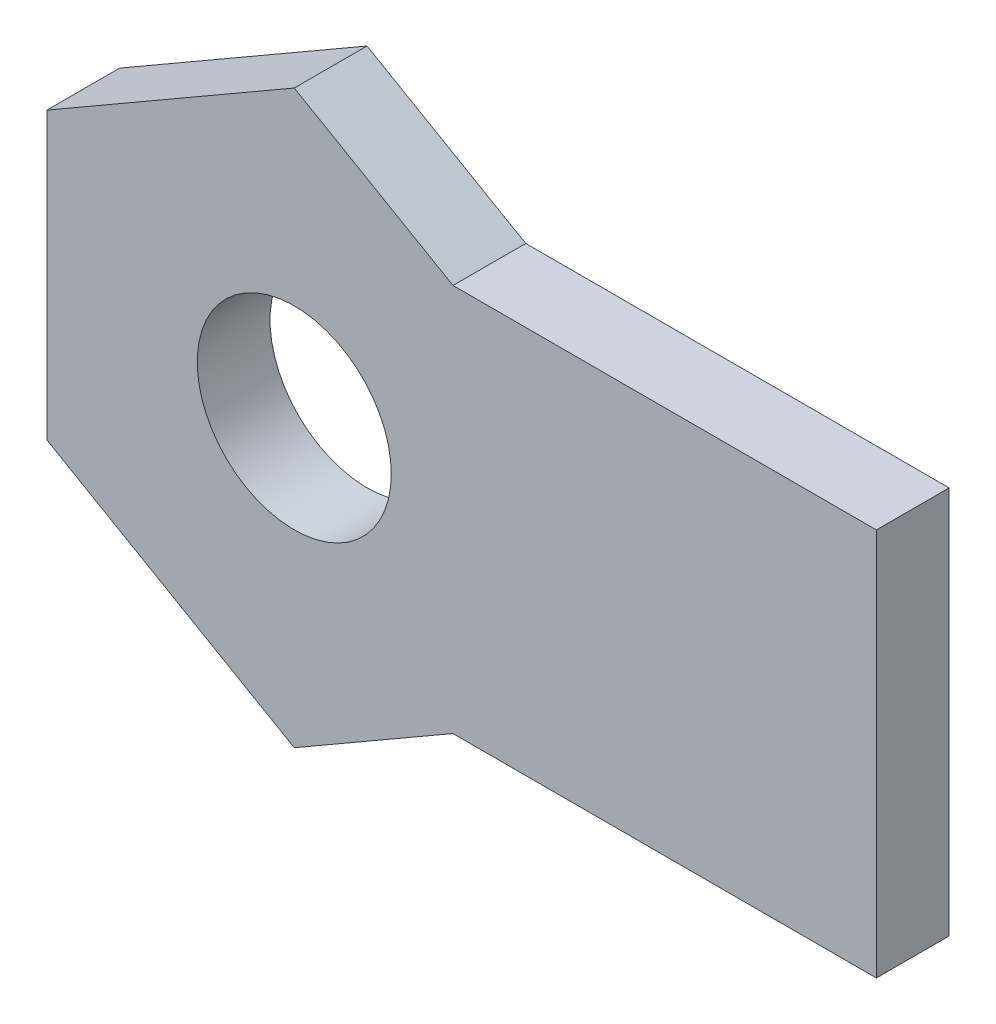
ISO-10303-21;
HEADER;
FILE_DESCRIPTION(('STEP AP214'),'2;1');
FILE_NAME('part.step','',(''),(''),'','','');
FILE_SCHEMA(('AUTOMOTIVE_DESIGN { 1 0 10303 214 1 1 1 1 }'));
ENDSEC;
DATA;
#1=APPLICATION_CONTEXT('core data for automotive mechanical design processes');
#2=APPLICATION_PROTOCOL_DEFINITION('international standard','automotive_design',2000,#1);
#3=PRODUCT_CONTEXT('',#1,'mechanical');
#4=PRODUCT('Part','Part','',(#3));
#5=PRODUCT_RELATED_PRODUCT_CATEGORY('part','',(#4));
#6=PRODUCT_DEFINITION_FORMATION('','',#4);
#7=PRODUCT_DEFINITION_CONTEXT('part definition',#1,'design');
#8=PRODUCT_DEFINITION('design','',#6,#7);
#9=PRODUCT_DEFINITION_SHAPE('','',#8);
#10=(LENGTH_UNIT() NAMED_UNIT(*) SI_UNIT(.MILLI.,.METRE.));
#11=(NAMED_UNIT(*) PLANE_ANGLE_UNIT() SI_UNIT($,.RADIAN.));
#12=(NAMED_UNIT(*) SI_UNIT($,.STERADIAN.) SOLID_ANGLE_UNIT());
#13=UNCERTAINTY_MEASURE_WITH_UNIT(LENGTH_MEASURE(1.E-05),#10,'distance_accuracy_value','');
#14=(GEOMETRIC_REPRESENTATION_CONTEXT(3) GLOBAL_UNCERTAINTY_ASSIGNED_CONTEXT((#13)) GLOBAL_UNIT_ASSIGNED_CONTEXT((#10,
#11,#12)) REPRESENTATION_CONTEXT('',''));
#15=CARTESIAN_POINT('',(0.,0.,0.));
#16=DIRECTION('',(0.,0.,1.));
#17=DIRECTION('',(1.,0.,0.));
#18=AXIS2_PLACEMENT_3D('',#15,#16,#17);
#19=CARTESIAN_POINT('',(-51.,0.,15.));
#20=DIRECTION('',(1.,0.,0.));
#21=DIRECTION('',(0.,1.,0.));
#22=AXIS2_PLACEMENT_3D('',#19,#20,#21);
#23=PLANE('',#22);
#24=DIRECTION('',(0.,-1.,0.));
#25=VECTOR('',#24,1.);
#26=CARTESIAN_POINT('',(-51.,0.,0.));
#27=LINE('',#26,#25);
#28=CARTESIAN_POINT('',(-51.,29.4448637286709,0.));
#29=VERTEX_POINT('',#28);
#30=CARTESIAN_POINT('',(-51.,-29.4448637286709,0.));
#31=VERTEX_POINT('',#30);
#32=EDGE_CURVE('E140',#29,#31,#27,.T.);
#33=ORIENTED_EDGE('',*,*,#32,.T.);
#34=DIRECTION('',(0.,0.,-1.));
#35=VECTOR('',#34,1.);
#36=CARTESIAN_POINT('',(-51.,-29.4448637286709,15.));
#37=LINE('',#36,#35);
#38=CARTESIAN_POINT('',(-51.,-29.4448637286709,15.));
#39=VERTEX_POINT('',#38);
#40=EDGE_CURVE('E11',#39,#31,#37,.T.);
#41=ORIENTED_EDGE('',*,*,#40,.F.);
#42=DIRECTION('',(0.,-1.,0.));
#43=VECTOR('',#42,1.);
#44=CARTESIAN_POINT('',(-51.,0.,15.));
#45=LINE('',#44,#43);
#46=CARTESIAN_POINT('',(-51.,29.4448637286709,15.));
#47=VERTEX_POINT('',#46);
#48=EDGE_CURVE('E183',#47,#39,#45,.T.);
#49=ORIENTED_EDGE('',*,*,#48,.F.);
#50=DIRECTION('',(0.,0.,-1.));
#51=VECTOR('',#50,1.);
#52=CARTESIAN_POINT('',(-51.,29.4448637286709,15.));
#53=LINE('',#52,#51);
#54=EDGE_CURVE('E136',#47,#29,#53,.T.);
#55=ORIENTED_EDGE('',*,*,#54,.T.);
#56=EDGE_LOOP('',(#33,#41,#49,#55));
#57=FACE_BOUND('',#56,.T.);
#58=ADVANCED_FACE('F39',(#57),#23,.F.);
#59=CARTESIAN_POINT('',(-25.5,-44.1672955930064,15.));
#60=DIRECTION('',(0.5,0.866025403784438,0.));
#61=DIRECTION('',(-0.866025403784439,0.5,0.));
#62=AXIS2_PLACEMENT_3D('',#59,#60,#61);
#63=PLANE('',#62);
#64=DIRECTION('',(0.866025403784439,-0.5,0.));
#65=VECTOR('',#64,1.);
#66=CARTESIAN_POINT('',(-25.5,-44.1672955930064,0.));
#67=LINE('',#66,#65);
#68=CARTESIAN_POINT('',(0.,-58.8897274573418,0.));
#69=VERTEX_POINT('',#68);
#70=EDGE_CURVE('E143',#31,#69,#67,.T.);
#71=ORIENTED_EDGE('',*,*,#70,.T.);
#72=DIRECTION('',(0.,0.,-1.));
#73=VECTOR('',#72,1.);
#74=CARTESIAN_POINT('',(0.,-58.8897274573418,15.));
#75=LINE('',#74,#73);
#76=CARTESIAN_POINT('',(0.,-58.8897274573418,15.));
#77=VERTEX_POINT('',#76);
#78=EDGE_CURVE('E48',#77,#69,#75,.T.);
#79=ORIENTED_EDGE('',*,*,#78,.F.);
#80=DIRECTION('',(0.866025403784439,-0.5,0.));
#81=VECTOR('',#80,1.);
#82=CARTESIAN_POINT('',(-25.5,-44.1672955930064,15.));
#83=LINE('',#82,#81);
#84=EDGE_CURVE('E98',#39,#77,#83,.T.);
#85=ORIENTED_EDGE('',*,*,#84,.F.);
#86=ORIENTED_EDGE('',*,*,#40,.T.);
#87=EDGE_LOOP('',(#71,#79,#85,#86));
#88=FACE_BOUND('',#87,.T.);
#89=ADVANCED_FACE('F201',(#88),#63,.F.);
#90=CARTESIAN_POINT('',(25.5,-44.1672955930064,15.));
#91=DIRECTION('',(-0.5,0.866025403784438,0.));
#92=DIRECTION('',(-0.866025403784438,-0.5,0.));
#93=AXIS2_PLACEMENT_3D('',#90,#91,#92);
#94=PLANE('',#93);
#95=DIRECTION('',(0.866025403784438,0.5,0.));
#96=VECTOR('',#95,1.);
#97=CARTESIAN_POINT('',(25.5,-44.1672955930064,0.));
#98=LINE('',#97,#96);
#99=CARTESIAN_POINT('',(32.7179676972449,-40.,0.));
#100=VERTEX_POINT('',#99);
#101=EDGE_CURVE('E145',#69,#100,#98,.T.);
#102=ORIENTED_EDGE('',*,*,#101,.T.);
#103=DIRECTION('',(0.,0.,-1.));
#104=VECTOR('',#103,1.);
#105=CARTESIAN_POINT('',(32.7179676972449,-40.,15.));
#106=LINE('',#105,#104);
#107=CARTESIAN_POINT('',(32.7179676972449,-40.,15.));
#108=VERTEX_POINT('',#107);
#109=EDGE_CURVE('E162',#108,#100,#106,.T.);
#110=ORIENTED_EDGE('',*,*,#109,.F.);
#111=DIRECTION('',(0.866025403784438,0.5,0.));
#112=VECTOR('',#111,1.);
#113=CARTESIAN_POINT('',(25.5,-44.1672955930064,15.));
#114=LINE('',#113,#112);
#115=EDGE_CURVE('E170',#77,#108,#114,.T.);
#116=ORIENTED_EDGE('',*,*,#115,.F.);
#117=ORIENTED_EDGE('',*,*,#78,.T.);
#118=EDGE_LOOP('',(#102,#110,#116,#117));
#119=FACE_BOUND('',#118,.T.);
#120=ADVANCED_FACE('F168',(#119),#94,.F.);
#121=CARTESIAN_POINT('',(0.,-40.,15.));
#122=DIRECTION('',(0.,1.,0.));
#123=DIRECTION('',(0.,0.,1.));
#124=AXIS2_PLACEMENT_3D('',#121,#122,#123);
#125=PLANE('',#124);
#126=DIRECTION('',(1.,0.,0.));
#127=VECTOR('',#126,1.);
#128=CARTESIAN_POINT('',(0.,-40.,0.));
#129=LINE('',#128,#127);
#130=CARTESIAN_POINT('',(120.,-40.,0.));
#131=VERTEX_POINT('',#130);
#132=EDGE_CURVE('E147',#100,#131,#129,.T.);
#133=ORIENTED_EDGE('',*,*,#132,.T.);
#134=DIRECTION('',(0.,0.,-1.));
#135=VECTOR('',#134,1.);
#136=CARTESIAN_POINT('',(120.,-40.,15.));
#137=LINE('',#136,#135);
#138=CARTESIAN_POINT('',(120.,-40.,15.));
#139=VERTEX_POINT('',#138);
#140=EDGE_CURVE('E160',#139,#131,#137,.T.);
#141=ORIENTED_EDGE('',*,*,#140,.F.);
#142=DIRECTION('',(1.,0.,0.));
#143=VECTOR('',#142,1.);
#144=CARTESIAN_POINT('',(0.,-40.,15.));
#145=LINE('',#144,#143);
#146=EDGE_CURVE('E131',#108,#139,#145,.T.);
#147=ORIENTED_EDGE('',*,*,#146,.F.);
#148=ORIENTED_EDGE('',*,*,#109,.T.);
#149=EDGE_LOOP('',(#133,#141,#147,#148));
#150=FACE_BOUND('',#149,.T.);
#151=ADVANCED_FACE('F178',(#150),#125,.F.);
#152=CARTESIAN_POINT('',(120.,0.,15.));
#153=DIRECTION('',(1.,0.,0.));
#154=DIRECTION('',(0.,1.,0.));
#155=AXIS2_PLACEMENT_3D('',#152,#153,#154);
#156=PLANE('',#155);
#157=DIRECTION('',(0.,-1.,0.));
#158=VECTOR('',#157,1.);
#159=CARTESIAN_POINT('',(120.,0.,0.));
#160=LINE('',#159,#158);
#161=CARTESIAN_POINT('',(120.,40.,0.));
#162=VERTEX_POINT('',#161);
#163=EDGE_CURVE('E150',#162,#131,#160,.T.);
#164=ORIENTED_EDGE('',*,*,#163,.F.);
#165=DIRECTION('',(0.,0.,-1.));
#166=VECTOR('',#165,1.);
#167=CARTESIAN_POINT('',(120.,40.,15.));
#168=LINE('',#167,#166);
#169=CARTESIAN_POINT('',(120.,40.,15.));
#170=VERTEX_POINT('',#169);
#171=EDGE_CURVE('E120',#170,#162,#168,.T.);
#172=ORIENTED_EDGE('',*,*,#171,.F.);
#173=DIRECTION('',(0.,-1.,0.));
#174=VECTOR('',#173,1.);
#175=CARTESIAN_POINT('',(120.,0.,15.));
#176=LINE('',#175,#174);
#177=EDGE_CURVE('E129',#170,#139,#176,.T.);
#178=ORIENTED_EDGE('',*,*,#177,.T.);
#179=ORIENTED_EDGE('',*,*,#140,.T.);
#180=EDGE_LOOP('',(#164,#172,#178,#179));
#181=FACE_BOUND('',#180,.T.);
#182=ADVANCED_FACE('F212',(#181),#156,.T.);
#183=CARTESIAN_POINT('',(0.,40.,15.));
#184=DIRECTION('',(0.,1.,0.));
#185=DIRECTION('',(-1.,0.,0.));
#186=AXIS2_PLACEMENT_3D('',#183,#184,#185);
#187=PLANE('',#186);
#188=DIRECTION('',(1.,0.,0.));
#189=VECTOR('',#188,1.);
#190=CARTESIAN_POINT('',(0.,40.,0.));
#191=LINE('',#190,#189);
#192=CARTESIAN_POINT('',(32.7179676972449,40.,0.));
#193=VERTEX_POINT('',#192);
#194=EDGE_CURVE('E119',#193,#162,#191,.T.);
#195=ORIENTED_EDGE('',*,*,#194,.F.);
#196=DIRECTION('',(0.,0.,-1.));
#197=VECTOR('',#196,1.);
#198=CARTESIAN_POINT('',(32.7179676972449,40.,15.));
#199=LINE('',#198,#197);
#200=CARTESIAN_POINT('',(32.7179676972449,40.,15.));
#201=VERTEX_POINT('',#200);
#202=EDGE_CURVE('E113',#201,#193,#199,.T.);
#203=ORIENTED_EDGE('',*,*,#202,.F.);
#204=DIRECTION('',(1.,0.,0.));
#205=VECTOR('',#204,1.);
#206=CARTESIAN_POINT('',(0.,40.,15.));
#207=LINE('',#206,#205);
#208=EDGE_CURVE('E117',#201,#170,#207,.T.);
#209=ORIENTED_EDGE('',*,*,#208,.T.);
#210=ORIENTED_EDGE('',*,*,#171,.T.);
#211=EDGE_LOOP('',(#195,#203,#209,#210));
#212=FACE_BOUND('',#211,.T.);
#213=ADVANCED_FACE('F115',(#212),#187,.T.);
#214=CARTESIAN_POINT('',(25.5,44.1672955930064,15.));
#215=DIRECTION('',(-0.5,-0.866025403784438,0.));
#216=DIRECTION('',(0.866025403784438,-0.5,0.));
#217=AXIS2_PLACEMENT_3D('',#214,#215,#216);
#218=PLANE('',#217);
#219=DIRECTION('',(-0.866025403784438,0.5,0.));
#220=VECTOR('',#219,1.);
#221=CARTESIAN_POINT('',(25.5,44.1672955930064,0.));
#222=LINE('',#221,#220);
#223=CARTESIAN_POINT('',(0.,58.8897274573419,0.));
#224=VERTEX_POINT('',#223);
#225=EDGE_CURVE('E84',#193,#224,#222,.T.);
#226=ORIENTED_EDGE('',*,*,#225,.T.);
#227=DIRECTION('',(0.,0.,-1.));
#228=VECTOR('',#227,1.);
#229=CARTESIAN_POINT('',(0.,58.8897274573419,15.));
#230=LINE('',#229,#228);
#231=CARTESIAN_POINT('',(0.,58.8897274573419,15.));
#232=VERTEX_POINT('',#231);
#233=EDGE_CURVE('E121',#232,#224,#230,.T.);
#234=ORIENTED_EDGE('',*,*,#233,.F.);
#235=DIRECTION('',(-0.866025403784438,0.5,0.));
#236=VECTOR('',#235,1.);
#237=CARTESIAN_POINT('',(25.5,44.1672955930064,15.));
#238=LINE('',#237,#236);
#239=EDGE_CURVE('E123',#201,#232,#238,.T.);
#240=ORIENTED_EDGE('',*,*,#239,.F.);
#241=ORIENTED_EDGE('',*,*,#202,.T.);
#242=EDGE_LOOP('',(#226,#234,#240,#241));
#243=FACE_BOUND('',#242,.T.);
#244=ADVANCED_FACE('F124',(#243),#218,.F.);
#245=CARTESIAN_POINT('',(0.,0.,15.));
#246=DIRECTION('',(0.,0.,-1.));
#247=DIRECTION('',(-1.,0.,0.));
#248=AXIS2_PLACEMENT_3D('',#245,#246,#247);
#249=CYLINDRICAL_SURFACE('',#248,20.);
#250=CARTESIAN_POINT('',(0.,0.,15.));
#251=DIRECTION('',(0.,0.,1.));
#252=DIRECTION('',(1.,0.,0.));
#253=AXIS2_PLACEMENT_3D('',#250,#251,#252);
#254=CIRCLE('',#253,20.);
#255=CARTESIAN_POINT('',(20.,0.,15.));
#256=VERTEX_POINT('',#255);
#257=EDGE_CURVE('E156',#256,#256,#254,.T.);
#258=ORIENTED_EDGE('',*,*,#257,.T.);
#259=EDGE_LOOP('',(#258));
#260=FACE_BOUND('',#259,.T.);
#261=CARTESIAN_POINT('',(0.,0.,0.));
#262=DIRECTION('',(0.,0.,1.));
#263=DIRECTION('',(1.,0.,0.));
#264=AXIS2_PLACEMENT_3D('',#261,#262,#263);
#265=CIRCLE('',#264,20.);
#266=CARTESIAN_POINT('',(20.,0.,0.));
#267=VERTEX_POINT('',#266);
#268=EDGE_CURVE('E137',#267,#267,#265,.T.);
#269=ORIENTED_EDGE('',*,*,#268,.F.);
#270=EDGE_LOOP('',(#269));
#271=FACE_BOUND('',#270,.T.);
#272=ADVANCED_FACE('F41',(#260,#271),#249,.F.);
#273=CARTESIAN_POINT('',(-25.5,44.1672955930064,15.));
#274=DIRECTION('',(0.5,-0.866025403784439,0.));
#275=DIRECTION('',(0.866025403784439,0.5,0.));
#276=AXIS2_PLACEMENT_3D('',#273,#274,#275);
#277=PLANE('',#276);
#278=DIRECTION('',(-0.866025403784439,-0.5,0.));
#279=VECTOR('',#278,1.);
#280=CARTESIAN_POINT('',(-25.5,44.1672955930064,0.));
#281=LINE('',#280,#279);
#282=EDGE_CURVE('E90',#224,#29,#281,.T.);
#283=ORIENTED_EDGE('',*,*,#282,.T.);
#284=ORIENTED_EDGE('',*,*,#54,.F.);
#285=DIRECTION('',(-0.866025403784439,-0.5,0.));
#286=VECTOR('',#285,1.);
#287=CARTESIAN_POINT('',(-25.5,44.1672955930064,15.));
#288=LINE('',#287,#286);
#289=EDGE_CURVE('E56',#232,#47,#288,.T.);
#290=ORIENTED_EDGE('',*,*,#289,.F.);
#291=ORIENTED_EDGE('',*,*,#233,.T.);
#292=EDGE_LOOP('',(#283,#284,#290,#291));
#293=FACE_BOUND('',#292,.T.);
#294=ADVANCED_FACE('F191',(#293),#277,.F.);
#295=CARTESIAN_POINT('',(0.,0.,15.));
#296=DIRECTION('',(0.,0.,1.));
#297=DIRECTION('',(1.,0.,0.));
#298=AXIS2_PLACEMENT_3D('',#295,#296,#297);
#299=PLANE('',#298);
#300=ORIENTED_EDGE('',*,*,#257,.F.);
#301=EDGE_LOOP('',(#300));
#302=FACE_BOUND('',#301,.T.);
#303=ORIENTED_EDGE('',*,*,#48,.T.);
#304=ORIENTED_EDGE('',*,*,#84,.T.);
#305=ORIENTED_EDGE('',*,*,#115,.T.);
#306=ORIENTED_EDGE('',*,*,#146,.T.);
#307=ORIENTED_EDGE('',*,*,#177,.F.);
#308=ORIENTED_EDGE('',*,*,#208,.F.);
#309=ORIENTED_EDGE('',*,*,#239,.T.);
#310=ORIENTED_EDGE('',*,*,#289,.T.);
#311=EDGE_LOOP('',(#303,#304,#305,#306,#307,#308,#309,#310));
#312=FACE_BOUND('',#311,.T.);
#313=ADVANCED_FACE('F127',(#302,#312),#299,.T.);
#314=CARTESIAN_POINT('',(0.,0.,0.));
#315=DIRECTION('',(0.,0.,1.));
#316=DIRECTION('',(1.,0.,0.));
#317=AXIS2_PLACEMENT_3D('',#314,#315,#316);
#318=PLANE('',#317);
#319=ORIENTED_EDGE('',*,*,#268,.T.);
#320=EDGE_LOOP('',(#319));
#321=FACE_BOUND('',#320,.T.);
#322=ORIENTED_EDGE('',*,*,#32,.F.);
#323=ORIENTED_EDGE('',*,*,#282,.F.);
#324=ORIENTED_EDGE('',*,*,#225,.F.);
#325=ORIENTED_EDGE('',*,*,#194,.T.);
#326=ORIENTED_EDGE('',*,*,#163,.T.);
#327=ORIENTED_EDGE('',*,*,#132,.F.);
#328=ORIENTED_EDGE('',*,*,#101,.F.);
#329=ORIENTED_EDGE('',*,*,#70,.F.);
#330=EDGE_LOOP('',(#322,#323,#324,#325,#326,#327,#328,#329));
#331=FACE_BOUND('',#330,.T.);
#332=ADVANCED_FACE('F174',(#321,#331),#318,.F.);
#333=CLOSED_SHELL('',(#58,#89,#120,#151,#182,#213,#244,#272,#294,#313,#332));
#334=MANIFOLD_SOLID_BREP('B2',#333);
#335=ADVANCED_BREP_SHAPE_REPRESENTATION('',(#18,#334),#14);
#336=SHAPE_DEFINITION_REPRESENTATION(#9,#335);
ENDSEC;
END-ISO-10303-21;
